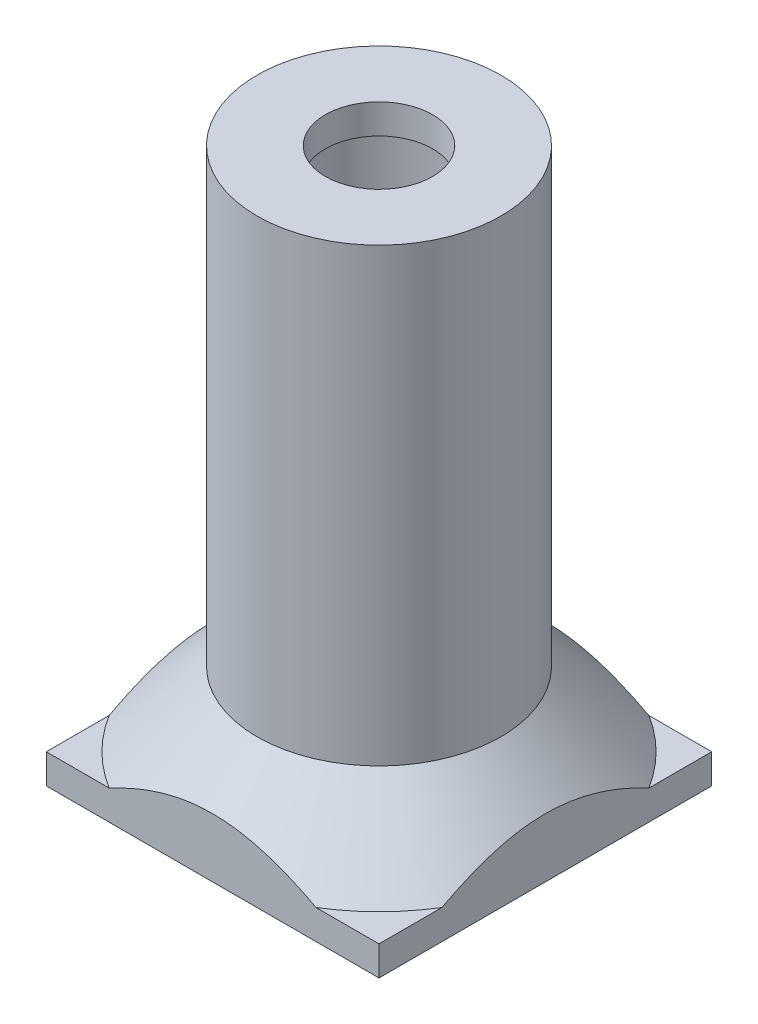
ISO-10303-21;
HEADER;
FILE_DESCRIPTION(('STEP AP214'),'2;1');
FILE_NAME('part.step','',(''),(''),'','','');
FILE_SCHEMA(('AUTOMOTIVE_DESIGN { 1 0 10303 214 1 1 1 1 }'));
ENDSEC;
DATA;
#1=APPLICATION_CONTEXT('core data for automotive mechanical design processes');
#2=APPLICATION_PROTOCOL_DEFINITION('international standard','automotive_design',2000,#1);
#3=PRODUCT_CONTEXT('',#1,'mechanical');
#4=PRODUCT('Part','Part','',(#3));
#5=PRODUCT_RELATED_PRODUCT_CATEGORY('part','',(#4));
#6=PRODUCT_DEFINITION_FORMATION('','',#4);
#7=PRODUCT_DEFINITION_CONTEXT('part definition',#1,'design');
#8=PRODUCT_DEFINITION('design','',#6,#7);
#9=PRODUCT_DEFINITION_SHAPE('','',#8);
#10=(LENGTH_UNIT() NAMED_UNIT(*) SI_UNIT(.MILLI.,.METRE.));
#11=(NAMED_UNIT(*) PLANE_ANGLE_UNIT() SI_UNIT($,.RADIAN.));
#12=(NAMED_UNIT(*) SI_UNIT($,.STERADIAN.) SOLID_ANGLE_UNIT());
#13=UNCERTAINTY_MEASURE_WITH_UNIT(LENGTH_MEASURE(1.E-05),#10,'distance_accuracy_value','');
#14=(GEOMETRIC_REPRESENTATION_CONTEXT(3) GLOBAL_UNCERTAINTY_ASSIGNED_CONTEXT((#13)) GLOBAL_UNIT_ASSIGNED_CONTEXT((#10,
#11,#12)) REPRESENTATION_CONTEXT('',''));
#15=CARTESIAN_POINT('',(0.,0.,0.));
#16=DIRECTION('',(0.,0.,1.));
#17=DIRECTION('',(1.,0.,0.));
#18=AXIS2_PLACEMENT_3D('',#15,#16,#17);
#19=CARTESIAN_POINT('',(0.,-67.,0.));
#20=DIRECTION('',(0.,-1.,0.));
#21=DIRECTION('',(0.,0.,-1.));
#22=AXIS2_PLACEMENT_3D('',#19,#20,#21);
#23=PLANE('',#22);
#24=DIRECTION('',(0.,0.,-1.));
#25=VECTOR('',#24,1.);
#26=CARTESIAN_POINT('',(-22.5,-67.,-22.5));
#27=LINE('',#26,#25);
#28=CARTESIAN_POINT('',(-22.5,-67.,-14.0000000000002));
#29=VERTEX_POINT('',#28);
#30=CARTESIAN_POINT('',(-22.5,-67.,-22.5));
#31=VERTEX_POINT('',#30);
#32=EDGE_CURVE('E241',#29,#31,#27,.T.);
#33=ORIENTED_EDGE('',*,*,#32,.F.);
#34=CARTESIAN_POINT('',(0.,-67.,0.));
#35=DIRECTION('',(0.,-1.,0.));
#36=DIRECTION('',(0.,0.,-1.));
#37=AXIS2_PLACEMENT_3D('',#34,#35,#36);
#38=CIRCLE('',#37,26.5000000000001);
#39=CARTESIAN_POINT('',(-14.0000000000001,-67.,-22.5));
#40=VERTEX_POINT('',#39);
#41=EDGE_CURVE('E180',#29,#40,#38,.T.);
#42=ORIENTED_EDGE('',*,*,#41,.T.);
#43=DIRECTION('',(1.,0.,0.));
#44=VECTOR('',#43,1.);
#45=CARTESIAN_POINT('',(22.5,-67.,-22.5));
#46=LINE('',#45,#44);
#47=EDGE_CURVE('E136',#31,#40,#46,.T.);
#48=ORIENTED_EDGE('',*,*,#47,.F.);
#49=EDGE_LOOP('',(#33,#42,#48));
#50=FACE_BOUND('',#49,.T.);
#51=ADVANCED_FACE('F43',(#50),#23,.F.);
#52=CARTESIAN_POINT('',(14.0000000000001,-67.,-22.5));
#53=VERTEX_POINT('',#52);
#54=CARTESIAN_POINT('',(22.5,-67.,-22.5));
#55=VERTEX_POINT('',#54);
#56=EDGE_CURVE('E240',#53,#55,#46,.T.);
#57=ORIENTED_EDGE('',*,*,#56,.F.);
#58=CARTESIAN_POINT('',(0.,-67.,0.));
#59=DIRECTION('',(0.,-1.,0.));
#60=DIRECTION('',(0.,0.,-1.));
#61=AXIS2_PLACEMENT_3D('',#58,#59,#60);
#62=CIRCLE('',#61,26.5000000000001);
#63=CARTESIAN_POINT('',(22.5,-67.,-14.0000000000001));
#64=VERTEX_POINT('',#63);
#65=EDGE_CURVE('E177',#53,#64,#62,.T.);
#66=ORIENTED_EDGE('',*,*,#65,.T.);
#67=DIRECTION('',(0.,0.,1.));
#68=VECTOR('',#67,1.);
#69=CARTESIAN_POINT('',(22.5,-67.,-22.5));
#70=LINE('',#69,#68);
#71=EDGE_CURVE('E222',#55,#64,#70,.T.);
#72=ORIENTED_EDGE('',*,*,#71,.F.);
#73=EDGE_LOOP('',(#57,#66,#72));
#74=FACE_BOUND('',#73,.T.);
#75=ADVANCED_FACE('F259',(#74),#23,.F.);
#76=CARTESIAN_POINT('',(22.5,-67.,14.0000000000001));
#77=VERTEX_POINT('',#76);
#78=CARTESIAN_POINT('',(22.5,-67.,22.5));
#79=VERTEX_POINT('',#78);
#80=EDGE_CURVE('E140',#77,#79,#70,.T.);
#81=ORIENTED_EDGE('',*,*,#80,.F.);
#82=CARTESIAN_POINT('',(0.,-67.,0.));
#83=DIRECTION('',(0.,-1.,0.));
#84=DIRECTION('',(0.,0.,-1.));
#85=AXIS2_PLACEMENT_3D('',#82,#83,#84);
#86=CIRCLE('',#85,26.5000000000001);
#87=CARTESIAN_POINT('',(14.0000000000001,-67.,22.5));
#88=VERTEX_POINT('',#87);
#89=EDGE_CURVE('E73',#77,#88,#86,.T.);
#90=ORIENTED_EDGE('',*,*,#89,.T.);
#91=DIRECTION('',(-1.,0.,0.));
#92=VECTOR('',#91,1.);
#93=CARTESIAN_POINT('',(22.5,-67.,22.5));
#94=LINE('',#93,#92);
#95=EDGE_CURVE('E226',#79,#88,#94,.T.);
#96=ORIENTED_EDGE('',*,*,#95,.F.);
#97=EDGE_LOOP('',(#81,#90,#96));
#98=FACE_BOUND('',#97,.T.);
#99=ADVANCED_FACE('F225',(#98),#23,.F.);
#100=CARTESIAN_POINT('',(0.,0.,0.));
#101=DIRECTION('',(0.,1.,0.));
#102=DIRECTION('',(0.,0.,1.));
#103=AXIS2_PLACEMENT_3D('',#100,#101,#102);
#104=PLANE('',#103);
#105=CARTESIAN_POINT('',(0.,0.,0.));
#106=DIRECTION('',(0.,1.,0.));
#107=DIRECTION('',(0.,0.,1.));
#108=AXIS2_PLACEMENT_3D('',#105,#106,#107);
#109=CIRCLE('',#108,7.25);
#110=CARTESIAN_POINT('',(0.,0.,7.25));
#111=VERTEX_POINT('',#110);
#112=EDGE_CURVE('E147',#111,#111,#109,.T.);
#113=ORIENTED_EDGE('',*,*,#112,.T.);
#114=EDGE_LOOP('',(#113));
#115=FACE_BOUND('',#114,.T.);
#116=CARTESIAN_POINT('',(0.,0.,0.));
#117=DIRECTION('',(0.,1.,0.));
#118=DIRECTION('',(0.,0.,1.));
#119=AXIS2_PLACEMENT_3D('',#116,#117,#118);
#120=CIRCLE('',#119,12.5);
#121=CARTESIAN_POINT('',(0.,0.,12.5));
#122=VERTEX_POINT('',#121);
#123=EDGE_CURVE('E153',#122,#122,#120,.T.);
#124=ORIENTED_EDGE('',*,*,#123,.F.);
#125=EDGE_LOOP('',(#124));
#126=FACE_BOUND('',#125,.T.);
#127=ADVANCED_FACE('F272',(#115,#126),#104,.F.);
#128=CARTESIAN_POINT('',(0.,4.,0.));
#129=DIRECTION('',(0.,-1.,0.));
#130=DIRECTION('',(0.,0.,-1.));
#131=AXIS2_PLACEMENT_3D('',#128,#129,#130);
#132=CYLINDRICAL_SURFACE('',#131,16.5);
#133=CARTESIAN_POINT('',(0.,-56.9999999999998,0.));
#134=DIRECTION('',(0.,-1.,0.));
#135=DIRECTION('',(0.,0.,-1.));
#136=AXIS2_PLACEMENT_3D('',#133,#134,#135);
#137=CIRCLE('',#136,16.5);
#138=CARTESIAN_POINT('',(0.,-56.9999999999998,-16.5));
#139=VERTEX_POINT('',#138);
#140=EDGE_CURVE('E157',#139,#139,#137,.F.);
#141=ORIENTED_EDGE('',*,*,#140,.T.);
#142=EDGE_LOOP('',(#141));
#143=FACE_BOUND('',#142,.T.);
#144=CARTESIAN_POINT('',(0.,4.,0.));
#145=DIRECTION('',(0.,1.,0.));
#146=DIRECTION('',(0.,0.,1.));
#147=AXIS2_PLACEMENT_3D('',#144,#145,#146);
#148=CIRCLE('',#147,16.5);
#149=CARTESIAN_POINT('',(0.,4.,16.5));
#150=VERTEX_POINT('',#149);
#151=EDGE_CURVE('E159',#150,#150,#148,.T.);
#152=ORIENTED_EDGE('',*,*,#151,.F.);
#153=EDGE_LOOP('',(#152));
#154=FACE_BOUND('',#153,.T.);
#155=ADVANCED_FACE('F295',(#143,#154),#132,.T.);
#156=CARTESIAN_POINT('',(0.,4.,0.));
#157=DIRECTION('',(0.,-1.,0.));
#158=DIRECTION('',(0.,0.,-1.));
#159=AXIS2_PLACEMENT_3D('',#156,#157,#158);
#160=CYLINDRICAL_SURFACE('',#159,7.25);
#161=CARTESIAN_POINT('',(0.,4.,0.));
#162=DIRECTION('',(0.,1.,0.));
#163=DIRECTION('',(0.,0.,1.));
#164=AXIS2_PLACEMENT_3D('',#161,#162,#163);
#165=CIRCLE('',#164,7.25);
#166=CARTESIAN_POINT('',(0.,4.,7.25));
#167=VERTEX_POINT('',#166);
#168=EDGE_CURVE('E158',#167,#167,#165,.T.);
#169=ORIENTED_EDGE('',*,*,#168,.T.);
#170=EDGE_LOOP('',(#169));
#171=FACE_BOUND('',#170,.T.);
#172=ORIENTED_EDGE('',*,*,#112,.F.);
#173=EDGE_LOOP('',(#172));
#174=FACE_BOUND('',#173,.T.);
#175=ADVANCED_FACE('F301',(#171,#174),#160,.F.);
#176=CARTESIAN_POINT('',(0.,4.,0.));
#177=DIRECTION('',(0.,1.,0.));
#178=DIRECTION('',(0.,0.,1.));
#179=AXIS2_PLACEMENT_3D('',#176,#177,#178);
#180=PLANE('',#179);
#181=ORIENTED_EDGE('',*,*,#151,.T.);
#182=EDGE_LOOP('',(#181));
#183=FACE_BOUND('',#182,.T.);
#184=ORIENTED_EDGE('',*,*,#168,.F.);
#185=EDGE_LOOP('',(#184));
#186=FACE_BOUND('',#185,.T.);
#187=ADVANCED_FACE('F282',(#183,#186),#180,.T.);
#188=CARTESIAN_POINT('',(0.,-67.,0.));
#189=DIRECTION('',(0.,1.,0.));
#190=DIRECTION('',(0.,0.,1.));
#191=AXIS2_PLACEMENT_3D('',#188,#189,#190);
#192=CYLINDRICAL_SURFACE('',#191,12.5);
#193=CARTESIAN_POINT('',(0.,-67.,0.));
#194=DIRECTION('',(0.,1.,0.));
#195=DIRECTION('',(0.,0.,1.));
#196=AXIS2_PLACEMENT_3D('',#193,#194,#195);
#197=CIRCLE('',#196,12.5);
#198=CARTESIAN_POINT('',(0.,-67.,12.5));
#199=VERTEX_POINT('',#198);
#200=EDGE_CURVE('E142',#199,#199,#197,.T.);
#201=ORIENTED_EDGE('',*,*,#200,.F.);
#202=EDGE_LOOP('',(#201));
#203=FACE_BOUND('',#202,.T.);
#204=ORIENTED_EDGE('',*,*,#123,.T.);
#205=EDGE_LOOP('',(#204));
#206=FACE_BOUND('',#205,.T.);
#207=ADVANCED_FACE('F277',(#203,#206),#192,.F.);
#208=CARTESIAN_POINT('',(-14.0000000000001,-67.,22.5));
#209=VERTEX_POINT('',#208);
#210=CARTESIAN_POINT('',(-22.5,-67.,22.5));
#211=VERTEX_POINT('',#210);
#212=EDGE_CURVE('E237',#209,#211,#94,.T.);
#213=ORIENTED_EDGE('',*,*,#212,.F.);
#214=CARTESIAN_POINT('',(0.,-67.,0.));
#215=DIRECTION('',(0.,-1.,0.));
#216=DIRECTION('',(0.,0.,-1.));
#217=AXIS2_PLACEMENT_3D('',#214,#215,#216);
#218=CIRCLE('',#217,26.5000000000001);
#219=CARTESIAN_POINT('',(-22.5,-67.,14.0000000000001));
#220=VERTEX_POINT('',#219);
#221=EDGE_CURVE('E172',#209,#220,#218,.T.);
#222=ORIENTED_EDGE('',*,*,#221,.T.);
#223=EDGE_CURVE('E236',#211,#220,#27,.T.);
#224=ORIENTED_EDGE('',*,*,#223,.F.);
#225=EDGE_LOOP('',(#213,#222,#224));
#226=FACE_BOUND('',#225,.T.);
#227=ADVANCED_FACE('F204',(#226),#23,.F.);
#228=CARTESIAN_POINT('',(0.,-71.,0.));
#229=DIRECTION('',(0.,-1.,0.));
#230=DIRECTION('',(0.,0.,-1.));
#231=AXIS2_PLACEMENT_3D('',#228,#229,#230);
#232=PLANE('',#231);
#233=DIRECTION('',(0.,0.,1.));
#234=VECTOR('',#233,1.);
#235=CARTESIAN_POINT('',(22.5,-71.,-22.5));
#236=LINE('',#235,#234);
#237=CARTESIAN_POINT('',(22.5,-71.,-22.5));
#238=VERTEX_POINT('',#237);
#239=CARTESIAN_POINT('',(22.5,-71.,22.5));
#240=VERTEX_POINT('',#239);
#241=EDGE_CURVE('E126',#238,#240,#236,.T.);
#242=ORIENTED_EDGE('',*,*,#241,.T.);
#243=DIRECTION('',(-1.,0.,0.));
#244=VECTOR('',#243,1.);
#245=CARTESIAN_POINT('',(22.5,-71.,22.5));
#246=LINE('',#245,#244);
#247=CARTESIAN_POINT('',(-22.5,-71.,22.5));
#248=VERTEX_POINT('',#247);
#249=EDGE_CURVE('E115',#240,#248,#246,.T.);
#250=ORIENTED_EDGE('',*,*,#249,.T.);
#251=DIRECTION('',(0.,0.,-1.));
#252=VECTOR('',#251,1.);
#253=CARTESIAN_POINT('',(-22.5,-71.,-22.5));
#254=LINE('',#253,#252);
#255=CARTESIAN_POINT('',(-22.5,-71.,-22.5));
#256=VERTEX_POINT('',#255);
#257=EDGE_CURVE('E125',#248,#256,#254,.T.);
#258=ORIENTED_EDGE('',*,*,#257,.T.);
#259=DIRECTION('',(1.,0.,0.));
#260=VECTOR('',#259,1.);
#261=CARTESIAN_POINT('',(22.5,-71.,-22.5));
#262=LINE('',#261,#260);
#263=EDGE_CURVE('E131',#256,#238,#262,.T.);
#264=ORIENTED_EDGE('',*,*,#263,.T.);
#265=EDGE_LOOP('',(#242,#250,#258,#264));
#266=FACE_BOUND('',#265,.T.);
#267=ADVANCED_FACE('F129',(#266),#232,.T.);
#268=CARTESIAN_POINT('',(22.5,-71.,-22.5));
#269=DIRECTION('',(0.,0.,1.));
#270=DIRECTION('',(1.,0.,0.));
#271=AXIS2_PLACEMENT_3D('',#268,#269,#270);
#272=PLANE('',#271);
#273=ORIENTED_EDGE('',*,*,#47,.T.);
#274=CARTESIAN_POINT('',(-14.0000000000001,-67.,-22.5));
#275=CARTESIAN_POINT('',(-13.6058170382711,-66.7917801069482,-22.5));
#276=CARTESIAN_POINT('',(-13.2090062174577,-66.5884583113915,-22.5));
#277=CARTESIAN_POINT('',(-12.4097070136794,-66.1929907543472,-22.5));
#278=CARTESIAN_POINT('',(-12.0072168950561,-66.0008485055826,-22.5));
#279=CARTESIAN_POINT('',(-11.1948096487098,-65.6285306615815,-22.5));
#280=CARTESIAN_POINT('',(-10.7848697570375,-65.4484044095669,-22.5));
#281=CARTESIAN_POINT('',(-9.95899819565903,-65.1026607419995,-22.5));
#282=CARTESIAN_POINT('',(-9.54306703967194,-64.9370420910189,-22.5));
#283=CARTESIAN_POINT('',(-8.29103164999155,-64.4665581113921,-22.5));
#284=CARTESIAN_POINT('',(-7.44555039567048,-64.1856654852251,-22.5));
#285=CARTESIAN_POINT('',(-6.16119447442754,-63.8246999616154,-22.5));
#286=CARTESIAN_POINT('',(-5.73064589853209,-63.7144876680368,-22.5));
#287=CARTESIAN_POINT('',(-4.86449447168767,-63.5159892863942,-22.5));
#288=CARTESIAN_POINT('',(-4.4288921251589,-63.4277010294528,-22.5));
#289=CARTESIAN_POINT('',(-3.6588295924349,-63.2931973158218,-22.5));
#290=CARTESIAN_POINT('',(-3.32523766426788,-63.2419699568426,-22.5));
#291=CARTESIAN_POINT('',(-2.6561748352873,-63.1538150400654,-22.5));
#292=CARTESIAN_POINT('',(-2.32070404442715,-63.1168866541633,-22.5));
#293=CARTESIAN_POINT('',(-1.64840298834027,-63.0578165615333,-22.5));
#294=CARTESIAN_POINT('',(-1.31157250357464,-63.0356773473171,-22.5));
#295=CARTESIAN_POINT('',(-0.637251354114289,-63.0065019342006,-22.5));
#296=CARTESIAN_POINT('',(-0.299760682411412,-62.9994658965071,-22.5));
#297=CARTESIAN_POINT('',(0.375202573691763,-63.0005973416613,-22.5));
#298=CARTESIAN_POINT('',(0.712675157522984,-63.0087651625871,-22.5));
#299=CARTESIAN_POINT('',(1.38691032685996,-63.0401888675157,-22.5));
#300=CARTESIAN_POINT('',(1.72367291966992,-63.0634445955307,-22.5));
#301=CARTESIAN_POINT('',(2.39579331185792,-63.1247175934893,-22.5));
#302=CARTESIAN_POINT('',(2.73115133280052,-63.1627324392216,-22.5));
#303=CARTESIAN_POINT('',(3.39994797454291,-63.2530178982146,-22.5));
#304=CARTESIAN_POINT('',(3.73338648406934,-63.3052893295937,-22.5));
#305=CARTESIAN_POINT('',(4.50003293365634,-63.4416135636978,-22.5));
#306=CARTESIAN_POINT('',(4.9323885556509,-63.5304965380908,-22.5));
#307=CARTESIAN_POINT('',(5.79207977773358,-63.7297911934622,-22.5));
#308=CARTESIAN_POINT('',(6.21941489580291,-63.8402049239868,-22.5));
#309=CARTESIAN_POINT('',(7.49417478629885,-64.2012260490661,-22.5));
#310=CARTESIAN_POINT('',(8.33335900527484,-64.4814285817918,-22.5));
#311=CARTESIAN_POINT('',(9.57605541087954,-64.9499944770052,-22.5));
#312=CARTESIAN_POINT('',(9.98881238225374,-65.1147902214429,-22.5));
#313=CARTESIAN_POINT('',(10.808424089862,-65.4586406149601,-22.5));
#314=CARTESIAN_POINT('',(11.2152783333501,-65.6376964464338,-22.5));
#315=CARTESIAN_POINT('',(12.0216545156768,-66.0076888065139,-22.5));
#316=CARTESIAN_POINT('',(12.4211983122694,-66.1985780076087,-22.5));
#317=CARTESIAN_POINT('',(13.2146903522668,-66.5913707021897,-22.5));
#318=CARTESIAN_POINT('',(13.6086402631585,-66.7932708226967,-22.5));
#319=CARTESIAN_POINT('',(14.0000000000001,-67.,-22.5));
#320=B_SPLINE_CURVE_WITH_KNOTS('',3,(#274,#275,#276,#277,#278,#279,#280,#281,#282,#283,#284,
#285,#286,#287,#288,#289,#290,#291,#292,#293,#294,#295,#296,#297,#298,#299,#300,#301,#302,#303,
#304,#305,#306,#307,#308,#309,#310,#311,#312,#313,#314,#315,#316,#317,#318,#319),.UNSPECIFIED.,
.F.,.F.,(4,2,2,2,2,2,2,2,2,2,2,2,2,2,2,2,2,2,2,2,2,2,4),(0.,1.33740866252961,2.67523530747741,
4.01825470995526,5.36115963315223,8.03000252515366,9.36285031988477,10.6955662075068,
11.707793450887,12.7199620638419,13.7323012209068,14.7446511833227,15.7570236569598,
16.7693856642516,17.7815814595774,18.7938353522866,20.1173834913002,21.4410576824844,
24.0914301809715,25.4245797822398,26.7578400387033,28.0860746717901,29.413904687039),.UNSPECIFIED.);
#321=EDGE_CURVE('E184',#40,#53,#320,.T.);
#322=ORIENTED_EDGE('',*,*,#321,.T.);
#323=ORIENTED_EDGE('',*,*,#56,.T.);
#324=DIRECTION('',(0.,1.,0.));
#325=VECTOR('',#324,1.);
#326=CARTESIAN_POINT('',(22.5,-71.,-22.5));
#327=LINE('',#326,#325);
#328=EDGE_CURVE('E250',#238,#55,#327,.T.);
#329=ORIENTED_EDGE('',*,*,#328,.F.);
#330=ORIENTED_EDGE('',*,*,#263,.F.);
#331=DIRECTION('',(0.,1.,0.));
#332=VECTOR('',#331,1.);
#333=CARTESIAN_POINT('',(-22.5,-71.,-22.5));
#334=LINE('',#333,#332);
#335=EDGE_CURVE('E149',#256,#31,#334,.T.);
#336=ORIENTED_EDGE('',*,*,#335,.T.);
#337=EDGE_LOOP('',(#273,#322,#323,#329,#330,#336));
#338=FACE_BOUND('',#337,.T.);
#339=ADVANCED_FACE('F198',(#338),#272,.F.);
#340=CARTESIAN_POINT('',(-22.5,-71.,-22.5));
#341=DIRECTION('',(1.,0.,0.));
#342=DIRECTION('',(0.,0.,-1.));
#343=AXIS2_PLACEMENT_3D('',#340,#341,#342);
#344=PLANE('',#343);
#345=ORIENTED_EDGE('',*,*,#223,.T.);
#346=CARTESIAN_POINT('',(-22.5,-67.,14.0000000000001));
#347=CARTESIAN_POINT('',(-22.5,-66.7917801069482,13.6058170382711));
#348=CARTESIAN_POINT('',(-22.5,-66.5884583113915,13.2090062174577));
#349=CARTESIAN_POINT('',(-22.5,-66.1929907543472,12.4097070136794));
#350=CARTESIAN_POINT('',(-22.5,-66.0008485055826,12.0072168950561));
#351=CARTESIAN_POINT('',(-22.5,-65.6285306615815,11.1948096487098));
#352=CARTESIAN_POINT('',(-22.5,-65.4484044095669,10.7848697570375));
#353=CARTESIAN_POINT('',(-22.5,-65.1026607419995,9.95899819565902));
#354=CARTESIAN_POINT('',(-22.5,-64.9370420910189,9.54306703967194));
#355=CARTESIAN_POINT('',(-22.5,-64.4665581113921,8.29103164999154));
#356=CARTESIAN_POINT('',(-22.5,-64.1856654852251,7.44555039567047));
#357=CARTESIAN_POINT('',(-22.5,-63.8246999616154,6.16119447442753));
#358=CARTESIAN_POINT('',(-22.5,-63.7144876680367,5.73064589853207));
#359=CARTESIAN_POINT('',(-22.5,-63.5159892863942,4.86449447168765));
#360=CARTESIAN_POINT('',(-22.5,-63.4277010294528,4.42889212515888));
#361=CARTESIAN_POINT('',(-22.5,-63.2931973158218,3.65882959243488));
#362=CARTESIAN_POINT('',(-22.5,-63.2419699568426,3.32523766426787));
#363=CARTESIAN_POINT('',(-22.5,-63.1538150400654,2.65617483528728));
#364=CARTESIAN_POINT('',(-22.5,-63.1168866541633,2.32070404442713));
#365=CARTESIAN_POINT('',(-22.5,-63.0578165615333,1.64840298834025));
#366=CARTESIAN_POINT('',(-22.5,-63.0356773473171,1.31157250357462));
#367=CARTESIAN_POINT('',(-22.5,-63.0065019342006,0.637251354114273));
#368=CARTESIAN_POINT('',(-22.5,-62.9994658965071,0.299760682411397));
#369=CARTESIAN_POINT('',(-22.5,-63.0005973416613,-0.375202573691778));
#370=CARTESIAN_POINT('',(-22.5,-63.0087651625871,-0.712675157522998));
#371=CARTESIAN_POINT('',(-22.5,-63.0401888675157,-1.38691032685998));
#372=CARTESIAN_POINT('',(-22.5,-63.0634445955307,-1.72367291966993));
#373=CARTESIAN_POINT('',(-22.5,-63.1247175934893,-2.39579331185793));
#374=CARTESIAN_POINT('',(-22.5,-63.1627324392216,-2.73115133280053));
#375=CARTESIAN_POINT('',(-22.5,-63.2530178982146,-3.39994797454292));
#376=CARTESIAN_POINT('',(-22.5,-63.3052893295937,-3.73338648406936));
#377=CARTESIAN_POINT('',(-22.5,-63.4416135636978,-4.50003293365636));
#378=CARTESIAN_POINT('',(-22.5,-63.5304965380908,-4.93238855565091));
#379=CARTESIAN_POINT('',(-22.5,-63.7297911934622,-5.79207977773359));
#380=CARTESIAN_POINT('',(-22.5,-63.8402049239868,-6.21941489580292));
#381=CARTESIAN_POINT('',(-22.5,-64.2012260490661,-7.49417478629887));
#382=CARTESIAN_POINT('',(-22.5,-64.4814285817918,-8.33335900527485));
#383=CARTESIAN_POINT('',(-22.5,-64.9499944770052,-9.57605541087955));
#384=CARTESIAN_POINT('',(-22.5,-65.1147902214429,-9.98881238225374));
#385=CARTESIAN_POINT('',(-22.5,-65.4586406149601,-10.808424089862));
#386=CARTESIAN_POINT('',(-22.5,-65.6376964464338,-11.2152783333501));
#387=CARTESIAN_POINT('',(-22.5,-66.0076888065139,-12.0216545156769));
#388=CARTESIAN_POINT('',(-22.5,-66.1985780076087,-12.4211983122694));
#389=CARTESIAN_POINT('',(-22.5,-66.5913707021897,-13.2146903522668));
#390=CARTESIAN_POINT('',(-22.5,-66.7932708226967,-13.6086402631586));
#391=CARTESIAN_POINT('',(-22.5,-67.,-14.0000000000002));
#392=B_SPLINE_CURVE_WITH_KNOTS('',3,(#346,#347,#348,#349,#350,#351,#352,#353,#354,#355,#356,
#357,#358,#359,#360,#361,#362,#363,#364,#365,#366,#367,#368,#369,#370,#371,#372,#373,#374,#375,
#376,#377,#378,#379,#380,#381,#382,#383,#384,#385,#386,#387,#388,#389,#390,#391),.UNSPECIFIED.,
.F.,.F.,(4,2,2,2,2,2,2,2,2,2,2,2,2,2,2,2,2,2,2,2,2,2,4),(0.,1.33740866252961,2.67523530747741,
4.01825470995527,5.36115963315224,8.03000252515367,9.36285031988478,10.6955662075069,
11.707793450887,12.7199620638419,13.7323012209068,14.7446511833227,15.7570236569598,
16.7693856642516,17.7815814595775,18.7938353522866,20.1173834913002,21.4410576824844,
24.0914301809716,25.4245797822398,26.7578400387033,28.0860746717901,29.413904687039),.UNSPECIFIED.);
#393=EDGE_CURVE('E11',#220,#29,#392,.T.);
#394=ORIENTED_EDGE('',*,*,#393,.T.);
#395=ORIENTED_EDGE('',*,*,#32,.T.);
#396=ORIENTED_EDGE('',*,*,#335,.F.);
#397=ORIENTED_EDGE('',*,*,#257,.F.);
#398=DIRECTION('',(0.,1.,0.));
#399=VECTOR('',#398,1.);
#400=CARTESIAN_POINT('',(-22.5,-71.,22.5));
#401=LINE('',#400,#399);
#402=EDGE_CURVE('E121',#248,#211,#401,.T.);
#403=ORIENTED_EDGE('',*,*,#402,.T.);
#404=EDGE_LOOP('',(#345,#394,#395,#396,#397,#403));
#405=FACE_BOUND('',#404,.T.);
#406=ADVANCED_FACE('F202',(#405),#344,.F.);
#407=CARTESIAN_POINT('',(22.5,-71.,22.5));
#408=DIRECTION('',(0.,0.,-1.));
#409=DIRECTION('',(-1.,0.,0.));
#410=AXIS2_PLACEMENT_3D('',#407,#408,#409);
#411=PLANE('',#410);
#412=ORIENTED_EDGE('',*,*,#95,.T.);
#413=CARTESIAN_POINT('',(14.0000000000001,-67.,22.5));
#414=CARTESIAN_POINT('',(13.6058170382711,-66.7917801069482,22.5));
#415=CARTESIAN_POINT('',(13.2090062174577,-66.5884583113915,22.5));
#416=CARTESIAN_POINT('',(12.4097070136794,-66.1929907543472,22.5));
#417=CARTESIAN_POINT('',(12.0072168950561,-66.0008485055826,22.5));
#418=CARTESIAN_POINT('',(11.1948096487098,-65.6285306615815,22.5));
#419=CARTESIAN_POINT('',(10.7848697570375,-65.4484044095669,22.5));
#420=CARTESIAN_POINT('',(9.95899819565903,-65.1026607419995,22.5));
#421=CARTESIAN_POINT('',(9.54306703967194,-64.9370420910189,22.5));
#422=CARTESIAN_POINT('',(8.29103164999155,-64.4665581113921,22.5));
#423=CARTESIAN_POINT('',(7.44555039567048,-64.1856654852251,22.5));
#424=CARTESIAN_POINT('',(6.16119447442753,-63.8246999616154,22.5));
#425=CARTESIAN_POINT('',(5.73064589853208,-63.7144876680368,22.5));
#426=CARTESIAN_POINT('',(4.86449447168766,-63.5159892863942,22.5));
#427=CARTESIAN_POINT('',(4.42889212515889,-63.4277010294528,22.5));
#428=CARTESIAN_POINT('',(3.65882959243489,-63.2931973158218,22.5));
#429=CARTESIAN_POINT('',(3.32523766426788,-63.2419699568426,22.5));
#430=CARTESIAN_POINT('',(2.65617483528729,-63.1538150400654,22.5));
#431=CARTESIAN_POINT('',(2.32070404442714,-63.1168866541633,22.5));
#432=CARTESIAN_POINT('',(1.64840298834026,-63.0578165615333,22.5));
#433=CARTESIAN_POINT('',(1.31157250357463,-63.0356773473171,22.5));
#434=CARTESIAN_POINT('',(0.637251354114284,-63.0065019342006,22.5));
#435=CARTESIAN_POINT('',(0.299760682411408,-62.9994658965071,22.5));
#436=CARTESIAN_POINT('',(-0.375202573691767,-63.0005973416613,22.5));
#437=CARTESIAN_POINT('',(-0.712675157522988,-63.0087651625871,22.5));
#438=CARTESIAN_POINT('',(-1.38691032685997,-63.0401888675157,22.5));
#439=CARTESIAN_POINT('',(-1.72367291966992,-63.0634445955307,22.5));
#440=CARTESIAN_POINT('',(-2.39579331185792,-63.1247175934893,22.5));
#441=CARTESIAN_POINT('',(-2.73115133280052,-63.1627324392216,22.5));
#442=CARTESIAN_POINT('',(-3.39994797454291,-63.2530178982146,22.5));
#443=CARTESIAN_POINT('',(-3.73338648406935,-63.3052893295937,22.5));
#444=CARTESIAN_POINT('',(-4.50003293365635,-63.4416135636978,22.5));
#445=CARTESIAN_POINT('',(-4.9323885556509,-63.5304965380908,22.5));
#446=CARTESIAN_POINT('',(-5.79207977773358,-63.7297911934622,22.5));
#447=CARTESIAN_POINT('',(-6.21941489580291,-63.8402049239868,22.5));
#448=CARTESIAN_POINT('',(-7.49417478629885,-64.2012260490661,22.5));
#449=CARTESIAN_POINT('',(-8.33335900527484,-64.4814285817918,22.5));
#450=CARTESIAN_POINT('',(-9.57605541087954,-64.9499944770052,22.5));
#451=CARTESIAN_POINT('',(-9.98881238225373,-65.1147902214429,22.5));
#452=CARTESIAN_POINT('',(-10.808424089862,-65.4586406149601,22.5));
#453=CARTESIAN_POINT('',(-11.2152783333501,-65.6376964464338,22.5));
#454=CARTESIAN_POINT('',(-12.0216545156768,-66.0076888065139,22.5));
#455=CARTESIAN_POINT('',(-12.4211983122694,-66.1985780076087,22.5));
#456=CARTESIAN_POINT('',(-13.2146903522668,-66.5913707021897,22.5));
#457=CARTESIAN_POINT('',(-13.6086402631585,-66.7932708226967,22.5));
#458=CARTESIAN_POINT('',(-14.0000000000001,-67.,22.5));
#459=B_SPLINE_CURVE_WITH_KNOTS('',3,(#413,#414,#415,#416,#417,#418,#419,#420,#421,#422,#423,
#424,#425,#426,#427,#428,#429,#430,#431,#432,#433,#434,#435,#436,#437,#438,#439,#440,#441,#442,
#443,#444,#445,#446,#447,#448,#449,#450,#451,#452,#453,#454,#455,#456,#457,#458),.UNSPECIFIED.,
.F.,.F.,(4,2,2,2,2,2,2,2,2,2,2,2,2,2,2,2,2,2,2,2,2,2,4),(0.,1.33740866252961,2.67523530747741,
4.01825470995526,5.36115963315224,8.03000252515367,9.36285031988478,10.6955662075068,
11.707793450887,12.7199620638419,13.7323012209068,14.7446511833227,15.7570236569598,
16.7693856642516,17.7815814595775,18.7938353522866,20.1173834913002,21.4410576824844,
24.0914301809715,25.4245797822398,26.7578400387033,28.0860746717901,29.413904687039),.UNSPECIFIED.);
#460=EDGE_CURVE('E59',#88,#209,#459,.T.);
#461=ORIENTED_EDGE('',*,*,#460,.T.);
#462=ORIENTED_EDGE('',*,*,#212,.T.);
#463=ORIENTED_EDGE('',*,*,#402,.F.);
#464=ORIENTED_EDGE('',*,*,#249,.F.);
#465=DIRECTION('',(0.,1.,0.));
#466=VECTOR('',#465,1.);
#467=CARTESIAN_POINT('',(22.5,-71.,22.5));
#468=LINE('',#467,#466);
#469=EDGE_CURVE('E119',#240,#79,#468,.T.);
#470=ORIENTED_EDGE('',*,*,#469,.T.);
#471=EDGE_LOOP('',(#412,#461,#462,#463,#464,#470));
#472=FACE_BOUND('',#471,.T.);
#473=ADVANCED_FACE('F117',(#472),#411,.F.);
#474=CARTESIAN_POINT('',(22.5,-71.,-22.5));
#475=DIRECTION('',(-1.,0.,0.));
#476=DIRECTION('',(0.,0.,1.));
#477=AXIS2_PLACEMENT_3D('',#474,#475,#476);
#478=PLANE('',#477);
#479=ORIENTED_EDGE('',*,*,#71,.T.);
#480=CARTESIAN_POINT('',(22.5,-67.,-14.0000000000001));
#481=CARTESIAN_POINT('',(22.5,-66.7917801069482,-13.6058170382711));
#482=CARTESIAN_POINT('',(22.5,-66.5884583113915,-13.2090062174577));
#483=CARTESIAN_POINT('',(22.5,-66.1929907543472,-12.4097070136794));
#484=CARTESIAN_POINT('',(22.5,-66.0008485055826,-12.0072168950561));
#485=CARTESIAN_POINT('',(22.5,-65.6285306615815,-11.1948096487098));
#486=CARTESIAN_POINT('',(22.5,-65.4484044095669,-10.7848697570375));
#487=CARTESIAN_POINT('',(22.5,-65.1026607419995,-9.95899819565902));
#488=CARTESIAN_POINT('',(22.5,-64.9370420910189,-9.54306703967193));
#489=CARTESIAN_POINT('',(22.5,-64.4665581113922,-8.29103164999153));
#490=CARTESIAN_POINT('',(22.5,-64.1856654852251,-7.44555039567046));
#491=CARTESIAN_POINT('',(22.5,-63.8246999616154,-6.16119447442752));
#492=CARTESIAN_POINT('',(22.5,-63.7144876680367,-5.73064589853206));
#493=CARTESIAN_POINT('',(22.5,-63.5159892863942,-4.86449447168764));
#494=CARTESIAN_POINT('',(22.5,-63.4277010294528,-4.42889212515887));
#495=CARTESIAN_POINT('',(22.5,-63.2931973158218,-3.65882959243488));
#496=CARTESIAN_POINT('',(22.5,-63.2419699568426,-3.32523766426786));
#497=CARTESIAN_POINT('',(22.5,-63.1538150400654,-2.65617483528728));
#498=CARTESIAN_POINT('',(22.5,-63.1168866541633,-2.32070404442713));
#499=CARTESIAN_POINT('',(22.5,-63.0578165615333,-1.64840298834025));
#500=CARTESIAN_POINT('',(22.5,-63.0356773473171,-1.31157250357462));
#501=CARTESIAN_POINT('',(22.5,-63.0065019342006,-0.637251354114267));
#502=CARTESIAN_POINT('',(22.5,-62.9994658965071,-0.29976068241139));
#503=CARTESIAN_POINT('',(22.5,-63.0005973416613,0.375202573691785));
#504=CARTESIAN_POINT('',(22.5,-63.0087651625871,0.712675157523006));
#505=CARTESIAN_POINT('',(22.5,-63.0401888675157,1.38691032685998));
#506=CARTESIAN_POINT('',(22.5,-63.0634445955307,1.72367291966994));
#507=CARTESIAN_POINT('',(22.5,-63.1247175934893,2.39579331185794));
#508=CARTESIAN_POINT('',(22.5,-63.1627324392216,2.73115133280054));
#509=CARTESIAN_POINT('',(22.5,-63.2530178982146,3.39994797454293));
#510=CARTESIAN_POINT('',(22.5,-63.3052893295937,3.73338648406937));
#511=CARTESIAN_POINT('',(22.5,-63.4416135636978,4.50003293365636));
#512=CARTESIAN_POINT('',(22.5,-63.5304965380908,4.93238855565092));
#513=CARTESIAN_POINT('',(22.5,-63.7297911934622,5.79207977773359));
#514=CARTESIAN_POINT('',(22.5,-63.8402049239868,6.21941489580292));
#515=CARTESIAN_POINT('',(22.5,-64.2012260490661,7.49417478629886));
#516=CARTESIAN_POINT('',(22.5,-64.4814285817918,8.33335900527484));
#517=CARTESIAN_POINT('',(22.5,-64.9499944770052,9.57605541087954));
#518=CARTESIAN_POINT('',(22.5,-65.1147902214429,9.98881238225373));
#519=CARTESIAN_POINT('',(22.5,-65.4586406149601,10.808424089862));
#520=CARTESIAN_POINT('',(22.5,-65.6376964464338,11.2152783333501));
#521=CARTESIAN_POINT('',(22.5,-66.0076888065139,12.0216545156768));
#522=CARTESIAN_POINT('',(22.5,-66.1985780076087,12.4211983122694));
#523=CARTESIAN_POINT('',(22.5,-66.5913707021897,13.2146903522668));
#524=CARTESIAN_POINT('',(22.5,-66.7932708226967,13.6086402631585));
#525=CARTESIAN_POINT('',(22.5,-67.,14.0000000000001));
#526=B_SPLINE_CURVE_WITH_KNOTS('',3,(#480,#481,#482,#483,#484,#485,#486,#487,#488,#489,#490,
#491,#492,#493,#494,#495,#496,#497,#498,#499,#500,#501,#502,#503,#504,#505,#506,#507,#508,#509,
#510,#511,#512,#513,#514,#515,#516,#517,#518,#519,#520,#521,#522,#523,#524,#525),.UNSPECIFIED.,
.F.,.F.,(4,2,2,2,2,2,2,2,2,2,2,2,2,2,2,2,2,2,2,2,2,2,4),(0.,1.33740866252962,2.67523530747741,
4.01825470995527,5.36115963315224,8.03000252515368,9.36285031988478,10.6955662075068,
11.707793450887,12.7199620638419,13.7323012209068,14.7446511833227,15.7570236569598,
16.7693856642516,17.7815814595775,18.7938353522866,20.1173834913002,21.4410576824844,
24.0914301809715,25.4245797822398,26.7578400387032,28.0860746717901,29.413904687039),.UNSPECIFIED.);
#527=EDGE_CURVE('E192',#64,#77,#526,.T.);
#528=ORIENTED_EDGE('',*,*,#527,.T.);
#529=ORIENTED_EDGE('',*,*,#80,.T.);
#530=ORIENTED_EDGE('',*,*,#469,.F.);
#531=ORIENTED_EDGE('',*,*,#241,.F.);
#532=ORIENTED_EDGE('',*,*,#328,.T.);
#533=EDGE_LOOP('',(#479,#528,#529,#530,#531,#532));
#534=FACE_BOUND('',#533,.T.);
#535=ADVANCED_FACE('F139',(#534),#478,.F.);
#536=ORIENTED_EDGE('',*,*,#200,.T.);
#537=EDGE_LOOP('',(#536));
#538=FACE_BOUND('',#537,.T.);
#539=ADVANCED_FACE('F273',(#538),#23,.F.);
#540=CARTESIAN_POINT('',(0.,-56.9999999999998,0.));
#541=DIRECTION('',(0.,-1.,0.));
#542=DIRECTION('',(0.,0.,-1.));
#543=AXIS2_PLACEMENT_3D('',#540,#541,#542);
#544=CONICAL_SURFACE('',#543,16.5,0.785398163397443);
#545=ORIENTED_EDGE('',*,*,#321,.F.);
#546=ORIENTED_EDGE('',*,*,#41,.F.);
#547=ORIENTED_EDGE('',*,*,#393,.F.);
#548=ORIENTED_EDGE('',*,*,#221,.F.);
#549=ORIENTED_EDGE('',*,*,#460,.F.);
#550=ORIENTED_EDGE('',*,*,#89,.F.);
#551=ORIENTED_EDGE('',*,*,#527,.F.);
#552=ORIENTED_EDGE('',*,*,#65,.F.);
#553=EDGE_LOOP('',(#545,#546,#547,#548,#549,#550,#551,#552));
#554=FACE_BOUND('',#553,.T.);
#555=ORIENTED_EDGE('',*,*,#140,.F.);
#556=EDGE_LOOP('',(#555));
#557=FACE_BOUND('',#556,.T.);
#558=ADVANCED_FACE('F46',(#554,#557),#544,.T.);
#559=CLOSED_SHELL('',(#51,#75,#99,#127,#155,#175,#187,#207,#227,#267,#339,#406,#473,#535,#539,#558));
#560=MANIFOLD_SOLID_BREP('B2',#559);
#561=ADVANCED_BREP_SHAPE_REPRESENTATION('',(#18,#560),#14);
#562=SHAPE_DEFINITION_REPRESENTATION(#9,#561);
ENDSEC;
END-ISO-10303-21;
